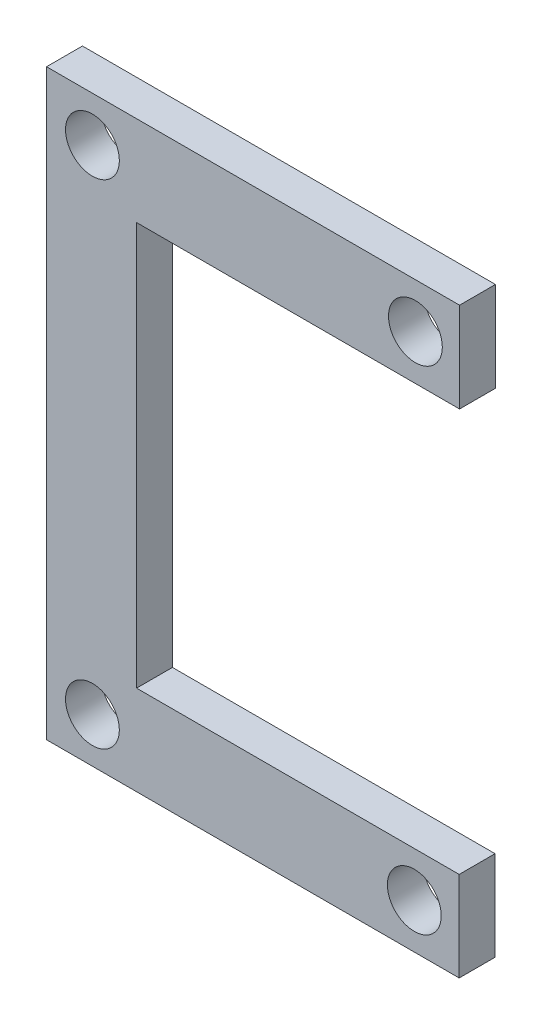
ISO-10303-21;
HEADER;
FILE_DESCRIPTION(('STEP AP214'),'2;1');
FILE_NAME('part.step','',(''),(''),'','','');
FILE_SCHEMA(('AUTOMOTIVE_DESIGN { 1 0 10303 214 1 1 1 1 }'));
ENDSEC;
DATA;
#1=APPLICATION_CONTEXT('core data for automotive mechanical design processes');
#2=APPLICATION_PROTOCOL_DEFINITION('international standard','automotive_design',2000,#1);
#3=PRODUCT_CONTEXT('',#1,'mechanical');
#4=PRODUCT('Part','Part','',(#3));
#5=PRODUCT_RELATED_PRODUCT_CATEGORY('part','',(#4));
#6=PRODUCT_DEFINITION_FORMATION('','',#4);
#7=PRODUCT_DEFINITION_CONTEXT('part definition',#1,'design');
#8=PRODUCT_DEFINITION('design','',#6,#7);
#9=PRODUCT_DEFINITION_SHAPE('','',#8);
#10=(LENGTH_UNIT() NAMED_UNIT(*) SI_UNIT(.MILLI.,.METRE.));
#11=(NAMED_UNIT(*) PLANE_ANGLE_UNIT() SI_UNIT($,.RADIAN.));
#12=(NAMED_UNIT(*) SI_UNIT($,.STERADIAN.) SOLID_ANGLE_UNIT());
#13=UNCERTAINTY_MEASURE_WITH_UNIT(LENGTH_MEASURE(1.E-05),#10,'distance_accuracy_value','');
#14=(GEOMETRIC_REPRESENTATION_CONTEXT(3) GLOBAL_UNCERTAINTY_ASSIGNED_CONTEXT((#13)) GLOBAL_UNIT_ASSIGNED_CONTEXT((#10,
#11,#12)) REPRESENTATION_CONTEXT('',''));
#15=CARTESIAN_POINT('',(0.,0.,0.));
#16=DIRECTION('',(0.,0.,1.));
#17=DIRECTION('',(1.,0.,0.));
#18=AXIS2_PLACEMENT_3D('',#15,#16,#17);
#19=CARTESIAN_POINT('',(0.,0.,2.));
#20=DIRECTION('',(0.,0.,1.));
#21=DIRECTION('',(1.,0.,0.));
#22=AXIS2_PLACEMENT_3D('',#19,#20,#21);
#23=PLANE('',#22);
#24=CARTESIAN_POINT('',(-86.4415216140092,-44.5171473885838,2.));
#25=DIRECTION('',(0.,0.,1.));
#26=DIRECTION('',(1.,0.,0.));
#27=AXIS2_PLACEMENT_3D('',#24,#25,#26);
#28=CIRCLE('',#27,1.5);
#29=CARTESIAN_POINT('',(-84.9415216140092,-44.5171473885838,2.));
#30=VERTEX_POINT('',#29);
#31=EDGE_CURVE('E297',#30,#30,#28,.T.);
#32=ORIENTED_EDGE('',*,*,#31,.F.);
#33=EDGE_LOOP('',(#32));
#34=FACE_BOUND('',#33,.T.);
#35=CARTESIAN_POINT('',(-68.4427814387621,-17.040230319695,2.));
#36=DIRECTION('',(0.,0.,1.));
#37=DIRECTION('',(1.,0.,0.));
#38=AXIS2_PLACEMENT_3D('',#35,#36,#37);
#39=CIRCLE('',#38,1.5);
#40=CARTESIAN_POINT('',(-66.9427814387621,-17.040230319695,2.));
#41=VERTEX_POINT('',#40);
#42=EDGE_CURVE('E243',#41,#41,#39,.T.);
#43=ORIENTED_EDGE('',*,*,#42,.F.);
#44=EDGE_LOOP('',(#43));
#45=FACE_BOUND('',#44,.T.);
#46=DIRECTION('',(1.,0.,0.));
#47=VECTOR('',#46,1.);
#48=CARTESIAN_POINT('',(-83.9814748535437,-19.5459878858621,2.));
#49=LINE('',#48,#47);
#50=CARTESIAN_POINT('',(-83.9814748535437,-19.5459878858621,2.));
#51=VERTEX_POINT('',#50);
#52=CARTESIAN_POINT('',(-65.9814748535437,-19.5459878858621,2.));
#53=VERTEX_POINT('',#52);
#54=EDGE_CURVE('E254',#51,#53,#49,.T.);
#55=ORIENTED_EDGE('',*,*,#54,.T.);
#56=DIRECTION('',(0.,1.,0.));
#57=VECTOR('',#56,1.);
#58=CARTESIAN_POINT('',(-65.9814748535437,-19.5459878858621,2.));
#59=LINE('',#58,#57);
#60=CARTESIAN_POINT('',(-65.9814748535437,-14.5344727535279,2.));
#61=VERTEX_POINT('',#60);
#62=EDGE_CURVE('E202',#53,#61,#59,.T.);
#63=ORIENTED_EDGE('',*,*,#62,.T.);
#64=DIRECTION('',(-1.,0.,0.));
#65=VECTOR('',#64,1.);
#66=CARTESIAN_POINT('',(-65.9814748535437,-14.5344727535279,2.));
#67=LINE('',#66,#65);
#68=CARTESIAN_POINT('',(-88.9981357606921,-14.5344727535279,2.));
#69=VERTEX_POINT('',#68);
#70=EDGE_CURVE('E269',#61,#69,#67,.T.);
#71=ORIENTED_EDGE('',*,*,#70,.T.);
#72=DIRECTION('',(0.,-1.,0.));
#73=VECTOR('',#72,1.);
#74=CARTESIAN_POINT('',(-88.9981357606921,-14.5344727535279,2.));
#75=LINE('',#74,#73);
#76=CARTESIAN_POINT('',(-88.9981357606921,-47.0171473885838,2.));
#77=VERTEX_POINT('',#76);
#78=EDGE_CURVE('E282',#69,#77,#75,.T.);
#79=ORIENTED_EDGE('',*,*,#78,.T.);
#80=DIRECTION('',(1.,0.,0.));
#81=VECTOR('',#80,1.);
#82=CARTESIAN_POINT('',(-88.9981357606921,-47.0171473885838,2.));
#83=LINE('',#82,#81);
#84=CARTESIAN_POINT('',(-66.0031662685617,-47.0171473885838,2.));
#85=VERTEX_POINT('',#84);
#86=EDGE_CURVE('E221',#77,#85,#83,.T.);
#87=ORIENTED_EDGE('',*,*,#86,.T.);
#88=DIRECTION('',(0.,1.,0.));
#89=VECTOR('',#88,1.);
#90=CARTESIAN_POINT('',(-66.0031662685617,-47.0171473885838,2.));
#91=LINE('',#90,#89);
#92=CARTESIAN_POINT('',(-66.0031662685617,-42.0171473885838,2.));
#93=VERTEX_POINT('',#92);
#94=EDGE_CURVE('E215',#85,#93,#91,.T.);
#95=ORIENTED_EDGE('',*,*,#94,.T.);
#96=DIRECTION('',(-1.,0.,0.));
#97=VECTOR('',#96,1.);
#98=CARTESIAN_POINT('',(-66.0031662685617,-42.0171473885838,2.));
#99=LINE('',#98,#97);
#100=CARTESIAN_POINT('',(-83.9814748535437,-42.0171473885838,2.));
#101=VERTEX_POINT('',#100);
#102=EDGE_CURVE('E219',#93,#101,#99,.T.);
#103=ORIENTED_EDGE('',*,*,#102,.T.);
#104=DIRECTION('',(0.,1.,0.));
#105=VECTOR('',#104,1.);
#106=CARTESIAN_POINT('',(-83.9814748535437,-42.0171473885838,2.));
#107=LINE('',#106,#105);
#108=EDGE_CURVE('E159',#101,#51,#107,.T.);
#109=ORIENTED_EDGE('',*,*,#108,.T.);
#110=EDGE_LOOP('',(#55,#63,#71,#79,#87,#95,#103,#109));
#111=FACE_BOUND('',#110,.T.);
#112=CARTESIAN_POINT('',(-86.4415216140092,-17.040230319695,2.));
#113=DIRECTION('',(0.,0.,1.));
#114=DIRECTION('',(1.,0.,0.));
#115=AXIS2_PLACEMENT_3D('',#112,#113,#114);
#116=CIRCLE('',#115,1.5);
#117=CARTESIAN_POINT('',(-84.9415216140092,-17.040230319695,2.));
#118=VERTEX_POINT('',#117);
#119=EDGE_CURVE('E291',#118,#118,#116,.T.);
#120=ORIENTED_EDGE('',*,*,#119,.F.);
#121=EDGE_LOOP('',(#120));
#122=FACE_BOUND('',#121,.T.);
#123=CARTESIAN_POINT('',(-68.5031662685617,-44.5171473885838,2.));
#124=DIRECTION('',(0.,0.,1.));
#125=DIRECTION('',(1.,0.,0.));
#126=AXIS2_PLACEMENT_3D('',#123,#124,#125);
#127=CIRCLE('',#126,1.5);
#128=CARTESIAN_POINT('',(-67.0031662685617,-44.5171473885838,2.));
#129=VERTEX_POINT('',#128);
#130=EDGE_CURVE('E303',#129,#129,#127,.T.);
#131=ORIENTED_EDGE('',*,*,#130,.F.);
#132=EDGE_LOOP('',(#131));
#133=FACE_BOUND('',#132,.T.);
#134=ADVANCED_FACE('F142',(#34,#45,#111,#122,#133),#23,.T.);
#135=CARTESIAN_POINT('',(0.,0.,0.));
#136=DIRECTION('',(0.,0.,1.));
#137=DIRECTION('',(1.,0.,0.));
#138=AXIS2_PLACEMENT_3D('',#135,#136,#137);
#139=PLANE('',#138);
#140=DIRECTION('',(1.,0.,0.));
#141=VECTOR('',#140,1.);
#142=CARTESIAN_POINT('',(-83.9814748535437,-19.5459878858621,0.));
#143=LINE('',#142,#141);
#144=CARTESIAN_POINT('',(-83.9814748535437,-19.5459878858621,0.));
#145=VERTEX_POINT('',#144);
#146=CARTESIAN_POINT('',(-65.9814748535437,-19.5459878858621,0.));
#147=VERTEX_POINT('',#146);
#148=EDGE_CURVE('E239',#145,#147,#143,.T.);
#149=ORIENTED_EDGE('',*,*,#148,.F.);
#150=DIRECTION('',(0.,1.,0.));
#151=VECTOR('',#150,1.);
#152=CARTESIAN_POINT('',(-83.9814748535437,-42.0171473885838,0.));
#153=LINE('',#152,#151);
#154=CARTESIAN_POINT('',(-83.9814748535437,-42.0171473885838,0.));
#155=VERTEX_POINT('',#154);
#156=EDGE_CURVE('E194',#155,#145,#153,.T.);
#157=ORIENTED_EDGE('',*,*,#156,.F.);
#158=DIRECTION('',(-1.,0.,0.));
#159=VECTOR('',#158,1.);
#160=CARTESIAN_POINT('',(-66.0031662685617,-42.0171473885838,0.));
#161=LINE('',#160,#159);
#162=CARTESIAN_POINT('',(-66.0031662685617,-42.0171473885838,0.));
#163=VERTEX_POINT('',#162);
#164=EDGE_CURVE('E188',#163,#155,#161,.T.);
#165=ORIENTED_EDGE('',*,*,#164,.F.);
#166=DIRECTION('',(0.,1.,0.));
#167=VECTOR('',#166,1.);
#168=CARTESIAN_POINT('',(-66.0031662685617,-47.0171473885838,0.));
#169=LINE('',#168,#167);
#170=CARTESIAN_POINT('',(-66.0031662685617,-47.0171473885838,0.));
#171=VERTEX_POINT('',#170);
#172=EDGE_CURVE('E229',#171,#163,#169,.T.);
#173=ORIENTED_EDGE('',*,*,#172,.F.);
#174=DIRECTION('',(1.,0.,0.));
#175=VECTOR('',#174,1.);
#176=CARTESIAN_POINT('',(-88.9981357606921,-47.0171473885838,0.));
#177=LINE('',#176,#175);
#178=CARTESIAN_POINT('',(-88.9981357606921,-47.0171473885838,0.));
#179=VERTEX_POINT('',#178);
#180=EDGE_CURVE('E249',#179,#171,#177,.T.);
#181=ORIENTED_EDGE('',*,*,#180,.F.);
#182=DIRECTION('',(0.,-1.,0.));
#183=VECTOR('',#182,1.);
#184=CARTESIAN_POINT('',(-88.9981357606921,-14.5344727535279,0.));
#185=LINE('',#184,#183);
#186=CARTESIAN_POINT('',(-88.9981357606921,-14.5344727535279,0.));
#187=VERTEX_POINT('',#186);
#188=EDGE_CURVE('E247',#187,#179,#185,.T.);
#189=ORIENTED_EDGE('',*,*,#188,.F.);
#190=DIRECTION('',(-1.,0.,0.));
#191=VECTOR('',#190,1.);
#192=CARTESIAN_POINT('',(-65.9814748535437,-14.5344727535279,0.));
#193=LINE('',#192,#191);
#194=CARTESIAN_POINT('',(-65.9814748535437,-14.5344727535279,0.));
#195=VERTEX_POINT('',#194);
#196=EDGE_CURVE('E245',#195,#187,#193,.T.);
#197=ORIENTED_EDGE('',*,*,#196,.F.);
#198=DIRECTION('',(0.,1.,0.));
#199=VECTOR('',#198,1.);
#200=CARTESIAN_POINT('',(-65.9814748535437,-19.5459878858621,0.));
#201=LINE('',#200,#199);
#202=EDGE_CURVE('E242',#147,#195,#201,.T.);
#203=ORIENTED_EDGE('',*,*,#202,.F.);
#204=EDGE_LOOP('',(#149,#157,#165,#173,#181,#189,#197,#203));
#205=FACE_BOUND('',#204,.T.);
#206=CARTESIAN_POINT('',(-68.4427814387621,-17.040230319695,0.));
#207=DIRECTION('',(0.,0.,1.));
#208=DIRECTION('',(1.,0.,0.));
#209=AXIS2_PLACEMENT_3D('',#206,#207,#208);
#210=CIRCLE('',#209,1.5);
#211=CARTESIAN_POINT('',(-66.9427814387621,-17.040230319695,0.));
#212=VERTEX_POINT('',#211);
#213=EDGE_CURVE('E288',#212,#212,#210,.T.);
#214=ORIENTED_EDGE('',*,*,#213,.T.);
#215=EDGE_LOOP('',(#214));
#216=FACE_BOUND('',#215,.T.);
#217=CARTESIAN_POINT('',(-86.4415216140092,-17.040230319695,0.));
#218=DIRECTION('',(0.,0.,1.));
#219=DIRECTION('',(1.,0.,0.));
#220=AXIS2_PLACEMENT_3D('',#217,#218,#219);
#221=CIRCLE('',#220,1.5);
#222=CARTESIAN_POINT('',(-84.9415216140092,-17.040230319695,0.));
#223=VERTEX_POINT('',#222);
#224=EDGE_CURVE('E294',#223,#223,#221,.T.);
#225=ORIENTED_EDGE('',*,*,#224,.T.);
#226=EDGE_LOOP('',(#225));
#227=FACE_BOUND('',#226,.T.);
#228=CARTESIAN_POINT('',(-86.4415216140092,-44.5171473885838,0.));
#229=DIRECTION('',(0.,0.,1.));
#230=DIRECTION('',(1.,0.,0.));
#231=AXIS2_PLACEMENT_3D('',#228,#229,#230);
#232=CIRCLE('',#231,1.5);
#233=CARTESIAN_POINT('',(-84.9415216140092,-44.5171473885838,0.));
#234=VERTEX_POINT('',#233);
#235=EDGE_CURVE('E300',#234,#234,#232,.T.);
#236=ORIENTED_EDGE('',*,*,#235,.T.);
#237=EDGE_LOOP('',(#236));
#238=FACE_BOUND('',#237,.T.);
#239=CARTESIAN_POINT('',(-68.5031662685617,-44.5171473885838,0.));
#240=DIRECTION('',(0.,0.,1.));
#241=DIRECTION('',(1.,0.,0.));
#242=AXIS2_PLACEMENT_3D('',#239,#240,#241);
#243=CIRCLE('',#242,1.5);
#244=CARTESIAN_POINT('',(-67.0031662685617,-44.5171473885838,0.));
#245=VERTEX_POINT('',#244);
#246=EDGE_CURVE('E306',#245,#245,#243,.T.);
#247=ORIENTED_EDGE('',*,*,#246,.T.);
#248=EDGE_LOOP('',(#247));
#249=FACE_BOUND('',#248,.T.);
#250=ADVANCED_FACE('F273',(#205,#216,#227,#238,#249),#139,.F.);
#251=CARTESIAN_POINT('',(-83.9814748535437,-19.5459878858621,2.));
#252=DIRECTION('',(0.,1.,0.));
#253=DIRECTION('',(0.,0.,1.));
#254=AXIS2_PLACEMENT_3D('',#251,#252,#253);
#255=PLANE('',#254);
#256=ORIENTED_EDGE('',*,*,#148,.T.);
#257=DIRECTION('',(0.,0.,-1.));
#258=VECTOR('',#257,1.);
#259=CARTESIAN_POINT('',(-65.9814748535437,-19.5459878858621,2.));
#260=LINE('',#259,#258);
#261=EDGE_CURVE('E12',#53,#147,#260,.T.);
#262=ORIENTED_EDGE('',*,*,#261,.F.);
#263=ORIENTED_EDGE('',*,*,#54,.F.);
#264=DIRECTION('',(0.,0.,-1.));
#265=VECTOR('',#264,1.);
#266=CARTESIAN_POINT('',(-83.9814748535437,-19.5459878858621,2.));
#267=LINE('',#266,#265);
#268=EDGE_CURVE('E235',#51,#145,#267,.T.);
#269=ORIENTED_EDGE('',*,*,#268,.T.);
#270=EDGE_LOOP('',(#256,#262,#263,#269));
#271=FACE_BOUND('',#270,.T.);
#272=ADVANCED_FACE('F144',(#271),#255,.F.);
#273=CARTESIAN_POINT('',(-65.9814748535437,-19.5459878858621,2.));
#274=DIRECTION('',(-1.,0.,0.));
#275=DIRECTION('',(0.,0.,1.));
#276=AXIS2_PLACEMENT_3D('',#273,#274,#275);
#277=PLANE('',#276);
#278=ORIENTED_EDGE('',*,*,#202,.T.);
#279=DIRECTION('',(0.,0.,-1.));
#280=VECTOR('',#279,1.);
#281=CARTESIAN_POINT('',(-65.9814748535437,-14.5344727535279,2.));
#282=LINE('',#281,#280);
#283=EDGE_CURVE('E151',#61,#195,#282,.T.);
#284=ORIENTED_EDGE('',*,*,#283,.F.);
#285=ORIENTED_EDGE('',*,*,#62,.F.);
#286=ORIENTED_EDGE('',*,*,#261,.T.);
#287=EDGE_LOOP('',(#278,#284,#285,#286));
#288=FACE_BOUND('',#287,.T.);
#289=ADVANCED_FACE('F340',(#288),#277,.F.);
#290=CARTESIAN_POINT('',(-65.9814748535437,-14.5344727535279,2.));
#291=DIRECTION('',(0.,-1.,0.));
#292=DIRECTION('',(1.,0.,0.));
#293=AXIS2_PLACEMENT_3D('',#290,#291,#292);
#294=PLANE('',#293);
#295=ORIENTED_EDGE('',*,*,#196,.T.);
#296=DIRECTION('',(0.,0.,-1.));
#297=VECTOR('',#296,1.);
#298=CARTESIAN_POINT('',(-88.9981357606921,-14.5344727535279,2.));
#299=LINE('',#298,#297);
#300=EDGE_CURVE('E261',#69,#187,#299,.T.);
#301=ORIENTED_EDGE('',*,*,#300,.F.);
#302=ORIENTED_EDGE('',*,*,#70,.F.);
#303=ORIENTED_EDGE('',*,*,#283,.T.);
#304=EDGE_LOOP('',(#295,#301,#302,#303));
#305=FACE_BOUND('',#304,.T.);
#306=ADVANCED_FACE('F267',(#305),#294,.F.);
#307=CARTESIAN_POINT('',(-88.9981357606921,-14.5344727535279,2.));
#308=DIRECTION('',(1.,0.,0.));
#309=DIRECTION('',(0.,0.,-1.));
#310=AXIS2_PLACEMENT_3D('',#307,#308,#309);
#311=PLANE('',#310);
#312=ORIENTED_EDGE('',*,*,#188,.T.);
#313=DIRECTION('',(0.,0.,-1.));
#314=VECTOR('',#313,1.);
#315=CARTESIAN_POINT('',(-88.9981357606921,-47.0171473885838,2.));
#316=LINE('',#315,#314);
#317=EDGE_CURVE('E258',#77,#179,#316,.T.);
#318=ORIENTED_EDGE('',*,*,#317,.F.);
#319=ORIENTED_EDGE('',*,*,#78,.F.);
#320=ORIENTED_EDGE('',*,*,#300,.T.);
#321=EDGE_LOOP('',(#312,#318,#319,#320));
#322=FACE_BOUND('',#321,.T.);
#323=ADVANCED_FACE('F278',(#322),#311,.F.);
#324=CARTESIAN_POINT('',(-88.9981357606921,-47.0171473885838,2.));
#325=DIRECTION('',(0.,1.,0.));
#326=DIRECTION('',(0.,0.,1.));
#327=AXIS2_PLACEMENT_3D('',#324,#325,#326);
#328=PLANE('',#327);
#329=ORIENTED_EDGE('',*,*,#180,.T.);
#330=DIRECTION('',(0.,0.,-1.));
#331=VECTOR('',#330,1.);
#332=CARTESIAN_POINT('',(-66.0031662685617,-47.0171473885838,2.));
#333=LINE('',#332,#331);
#334=EDGE_CURVE('E230',#85,#171,#333,.T.);
#335=ORIENTED_EDGE('',*,*,#334,.F.);
#336=ORIENTED_EDGE('',*,*,#86,.F.);
#337=ORIENTED_EDGE('',*,*,#317,.T.);
#338=EDGE_LOOP('',(#329,#335,#336,#337));
#339=FACE_BOUND('',#338,.T.);
#340=ADVANCED_FACE('F281',(#339),#328,.F.);
#341=CARTESIAN_POINT('',(-66.0031662685617,-47.0171473885838,2.));
#342=DIRECTION('',(-1.,0.,0.));
#343=DIRECTION('',(0.,0.,1.));
#344=AXIS2_PLACEMENT_3D('',#341,#342,#343);
#345=PLANE('',#344);
#346=ORIENTED_EDGE('',*,*,#172,.T.);
#347=DIRECTION('',(0.,0.,-1.));
#348=VECTOR('',#347,1.);
#349=CARTESIAN_POINT('',(-66.0031662685617,-42.0171473885838,2.));
#350=LINE('',#349,#348);
#351=EDGE_CURVE('E226',#93,#163,#350,.T.);
#352=ORIENTED_EDGE('',*,*,#351,.F.);
#353=ORIENTED_EDGE('',*,*,#94,.F.);
#354=ORIENTED_EDGE('',*,*,#334,.T.);
#355=EDGE_LOOP('',(#346,#352,#353,#354));
#356=FACE_BOUND('',#355,.T.);
#357=ADVANCED_FACE('F227',(#356),#345,.F.);
#358=CARTESIAN_POINT('',(-66.0031662685617,-42.0171473885838,2.));
#359=DIRECTION('',(0.,-1.,0.));
#360=DIRECTION('',(0.,0.,-1.));
#361=AXIS2_PLACEMENT_3D('',#358,#359,#360);
#362=PLANE('',#361);
#363=ORIENTED_EDGE('',*,*,#164,.T.);
#364=DIRECTION('',(0.,0.,-1.));
#365=VECTOR('',#364,1.);
#366=CARTESIAN_POINT('',(-83.9814748535437,-42.0171473885838,2.));
#367=LINE('',#366,#365);
#368=EDGE_CURVE('E231',#101,#155,#367,.T.);
#369=ORIENTED_EDGE('',*,*,#368,.F.);
#370=ORIENTED_EDGE('',*,*,#102,.F.);
#371=ORIENTED_EDGE('',*,*,#351,.T.);
#372=EDGE_LOOP('',(#363,#369,#370,#371));
#373=FACE_BOUND('',#372,.T.);
#374=ADVANCED_FACE('F233',(#373),#362,.F.);
#375=CARTESIAN_POINT('',(-83.9814748535437,-42.0171473885838,2.));
#376=DIRECTION('',(-1.,0.,0.));
#377=DIRECTION('',(0.,0.,1.));
#378=AXIS2_PLACEMENT_3D('',#375,#376,#377);
#379=PLANE('',#378);
#380=ORIENTED_EDGE('',*,*,#156,.T.);
#381=ORIENTED_EDGE('',*,*,#268,.F.);
#382=ORIENTED_EDGE('',*,*,#108,.F.);
#383=ORIENTED_EDGE('',*,*,#368,.T.);
#384=EDGE_LOOP('',(#380,#381,#382,#383));
#385=FACE_BOUND('',#384,.T.);
#386=ADVANCED_FACE('F328',(#385),#379,.F.);
#387=CARTESIAN_POINT('',(-68.4427814387621,-17.040230319695,2.));
#388=DIRECTION('',(0.,0.,-1.));
#389=DIRECTION('',(-1.,0.,0.));
#390=AXIS2_PLACEMENT_3D('',#387,#388,#389);
#391=CYLINDRICAL_SURFACE('',#390,1.5);
#392=ORIENTED_EDGE('',*,*,#42,.T.);
#393=EDGE_LOOP('',(#392));
#394=FACE_BOUND('',#393,.T.);
#395=ORIENTED_EDGE('',*,*,#213,.F.);
#396=EDGE_LOOP('',(#395));
#397=FACE_BOUND('',#396,.T.);
#398=ADVANCED_FACE('F325',(#394,#397),#391,.F.);
#399=CARTESIAN_POINT('',(-86.4415216140092,-17.040230319695,2.));
#400=DIRECTION('',(0.,0.,-1.));
#401=DIRECTION('',(-1.,0.,0.));
#402=AXIS2_PLACEMENT_3D('',#399,#400,#401);
#403=CYLINDRICAL_SURFACE('',#402,1.5);
#404=ORIENTED_EDGE('',*,*,#119,.T.);
#405=EDGE_LOOP('',(#404));
#406=FACE_BOUND('',#405,.T.);
#407=ORIENTED_EDGE('',*,*,#224,.F.);
#408=EDGE_LOOP('',(#407));
#409=FACE_BOUND('',#408,.T.);
#410=ADVANCED_FACE('F408',(#406,#409),#403,.F.);
#411=CARTESIAN_POINT('',(-86.4415216140092,-44.5171473885838,2.));
#412=DIRECTION('',(0.,0.,-1.));
#413=DIRECTION('',(-1.,0.,0.));
#414=AXIS2_PLACEMENT_3D('',#411,#412,#413);
#415=CYLINDRICAL_SURFACE('',#414,1.5);
#416=ORIENTED_EDGE('',*,*,#31,.T.);
#417=EDGE_LOOP('',(#416));
#418=FACE_BOUND('',#417,.T.);
#419=ORIENTED_EDGE('',*,*,#235,.F.);
#420=EDGE_LOOP('',(#419));
#421=FACE_BOUND('',#420,.T.);
#422=ADVANCED_FACE('F416',(#418,#421),#415,.F.);
#423=CARTESIAN_POINT('',(-68.5031662685617,-44.5171473885838,2.));
#424=DIRECTION('',(0.,0.,-1.));
#425=DIRECTION('',(-1.,0.,0.));
#426=AXIS2_PLACEMENT_3D('',#423,#424,#425);
#427=CYLINDRICAL_SURFACE('',#426,1.5);
#428=ORIENTED_EDGE('',*,*,#130,.T.);
#429=EDGE_LOOP('',(#428));
#430=FACE_BOUND('',#429,.T.);
#431=ORIENTED_EDGE('',*,*,#246,.F.);
#432=EDGE_LOOP('',(#431));
#433=FACE_BOUND('',#432,.T.);
#434=ADVANCED_FACE('F312',(#430,#433),#427,.F.);
#435=CLOSED_SHELL('',(#134,#250,#272,#289,#306,#323,#340,#357,#374,#386,#398,#410,#422,#434));
#436=MANIFOLD_SOLID_BREP('B2',#435);
#437=ADVANCED_BREP_SHAPE_REPRESENTATION('',(#18,#436),#14);
#438=SHAPE_DEFINITION_REPRESENTATION(#9,#437);
ENDSEC;
END-ISO-10303-21;
